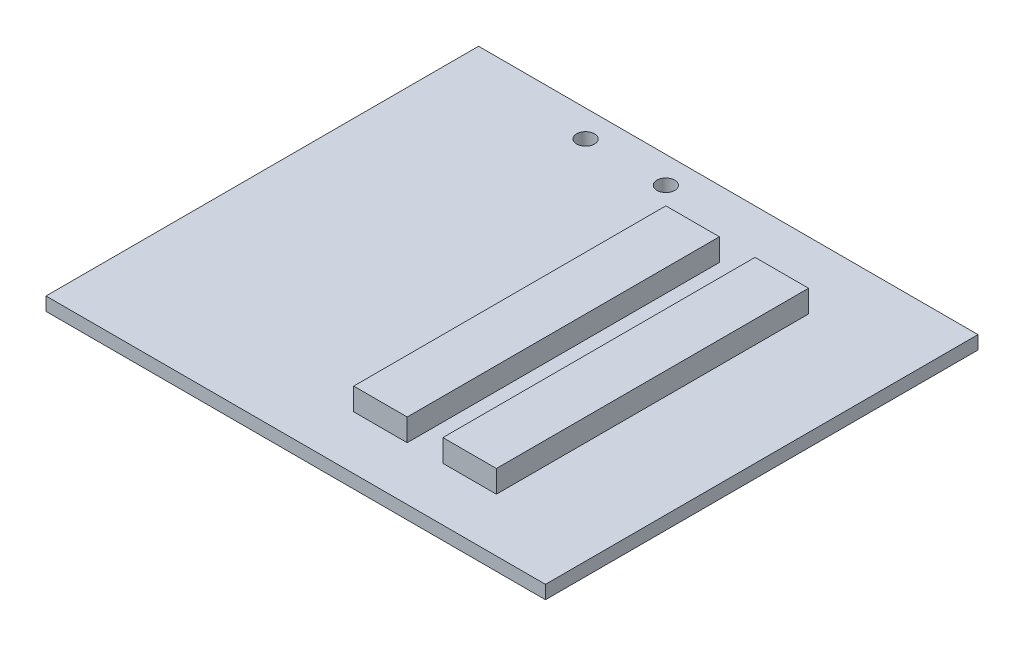
ISO-10303-21;
HEADER;
FILE_DESCRIPTION(('STEP AP214'),'2;1');
FILE_NAME('part.step','',(''),(''),'','','');
FILE_SCHEMA(('AUTOMOTIVE_DESIGN { 1 0 10303 214 1 1 1 1 }'));
ENDSEC;
DATA;
#1=APPLICATION_CONTEXT('core data for automotive mechanical design processes');
#2=APPLICATION_PROTOCOL_DEFINITION('international standard','automotive_design',2000,#1);
#3=PRODUCT_CONTEXT('',#1,'mechanical');
#4=PRODUCT('Part','Part','',(#3));
#5=PRODUCT_RELATED_PRODUCT_CATEGORY('part','',(#4));
#6=PRODUCT_DEFINITION_FORMATION('','',#4);
#7=PRODUCT_DEFINITION_CONTEXT('part definition',#1,'design');
#8=PRODUCT_DEFINITION('design','',#6,#7);
#9=PRODUCT_DEFINITION_SHAPE('','',#8);
#10=(LENGTH_UNIT() NAMED_UNIT(*) SI_UNIT(.MILLI.,.METRE.));
#11=(NAMED_UNIT(*) PLANE_ANGLE_UNIT() SI_UNIT($,.RADIAN.));
#12=(NAMED_UNIT(*) SI_UNIT($,.STERADIAN.) SOLID_ANGLE_UNIT());
#13=UNCERTAINTY_MEASURE_WITH_UNIT(LENGTH_MEASURE(1.E-05),#10,'distance_accuracy_value','');
#14=(GEOMETRIC_REPRESENTATION_CONTEXT(3) GLOBAL_UNCERTAINTY_ASSIGNED_CONTEXT((#13)) GLOBAL_UNIT_ASSIGNED_CONTEXT((#10,
#11,#12)) REPRESENTATION_CONTEXT('',''));
#15=CARTESIAN_POINT('',(0.,0.,0.));
#16=DIRECTION('',(0.,0.,1.));
#17=DIRECTION('',(1.,0.,0.));
#18=AXIS2_PLACEMENT_3D('',#15,#16,#17);
#19=CARTESIAN_POINT('',(0.,0.,0.));
#20=DIRECTION('',(0.,1.,0.));
#21=DIRECTION('',(0.,0.,1.));
#22=AXIS2_PLACEMENT_3D('',#19,#20,#21);
#23=PLANE('',#22);
#24=CARTESIAN_POINT('',(-4.00000000000001,0.,-21.25));
#25=DIRECTION('',(0.,1.,0.));
#26=DIRECTION('',(0.,0.,1.));
#27=AXIS2_PLACEMENT_3D('',#24,#25,#26);
#28=CIRCLE('',#27,1.);
#29=CARTESIAN_POINT('',(-4.00000000000001,0.,-20.25));
#30=VERTEX_POINT('',#29);
#31=EDGE_CURVE('E236',#30,#30,#28,.T.);
#32=ORIENTED_EDGE('',*,*,#31,.T.);
#33=EDGE_LOOP('',(#32));
#34=FACE_BOUND('',#33,.T.);
#35=CARTESIAN_POINT('',(-13.,0.,-21.25));
#36=DIRECTION('',(0.,1.,0.));
#37=DIRECTION('',(0.,0.,1.));
#38=AXIS2_PLACEMENT_3D('',#35,#36,#37);
#39=CIRCLE('',#38,1.);
#40=CARTESIAN_POINT('',(-13.,0.,-20.25));
#41=VERTEX_POINT('',#40);
#42=EDGE_CURVE('E240',#41,#41,#39,.T.);
#43=ORIENTED_EDGE('',*,*,#42,.T.);
#44=EDGE_LOOP('',(#43));
#45=FACE_BOUND('',#44,.T.);
#46=DIRECTION('',(1.,0.,0.));
#47=VECTOR('',#46,1.);
#48=CARTESIAN_POINT('',(-22.5,0.,-13.25));
#49=LINE('',#48,#47);
#50=CARTESIAN_POINT('',(-28.,0.,-13.25));
#51=VERTEX_POINT('',#50);
#52=CARTESIAN_POINT('',(-22.5,0.,-13.25));
#53=VERTEX_POINT('',#52);
#54=EDGE_CURVE('E11',#51,#53,#49,.T.);
#55=ORIENTED_EDGE('',*,*,#54,.F.);
#56=DIRECTION('',(0.,0.,1.));
#57=VECTOR('',#56,1.);
#58=CARTESIAN_POINT('',(-28.,0.,-24.25));
#59=LINE('',#58,#57);
#60=CARTESIAN_POINT('',(-28.,0.,-24.25));
#61=VERTEX_POINT('',#60);
#62=EDGE_CURVE('E265',#61,#51,#59,.T.);
#63=ORIENTED_EDGE('',*,*,#62,.F.);
#64=DIRECTION('',(-1.,0.,0.));
#65=VECTOR('',#64,1.);
#66=CARTESIAN_POINT('',(-28.,0.,-24.25));
#67=LINE('',#66,#65);
#68=CARTESIAN_POINT('',(28.,0.,-24.25));
#69=VERTEX_POINT('',#68);
#70=EDGE_CURVE('E262',#69,#61,#67,.T.);
#71=ORIENTED_EDGE('',*,*,#70,.F.);
#72=DIRECTION('',(0.,0.,-1.));
#73=VECTOR('',#72,1.);
#74=CARTESIAN_POINT('',(28.,0.,-24.25));
#75=LINE('',#74,#73);
#76=CARTESIAN_POINT('',(28.,0.,24.25));
#77=VERTEX_POINT('',#76);
#78=EDGE_CURVE('E246',#77,#69,#75,.T.);
#79=ORIENTED_EDGE('',*,*,#78,.F.);
#80=DIRECTION('',(1.,0.,0.));
#81=VECTOR('',#80,1.);
#82=CARTESIAN_POINT('',(-28.,0.,24.25));
#83=LINE('',#82,#81);
#84=CARTESIAN_POINT('',(-28.,0.,24.25));
#85=VERTEX_POINT('',#84);
#86=EDGE_CURVE('E253',#85,#77,#83,.T.);
#87=ORIENTED_EDGE('',*,*,#86,.F.);
#88=CARTESIAN_POINT('',(-28.,0.,-1.25));
#89=VERTEX_POINT('',#88);
#90=EDGE_CURVE('E264',#89,#85,#59,.T.);
#91=ORIENTED_EDGE('',*,*,#90,.F.);
#92=DIRECTION('',(-1.,0.,0.));
#93=VECTOR('',#92,1.);
#94=CARTESIAN_POINT('',(-22.5,0.,-1.25));
#95=LINE('',#94,#93);
#96=CARTESIAN_POINT('',(-22.5,0.,-1.25));
#97=VERTEX_POINT('',#96);
#98=EDGE_CURVE('E54',#97,#89,#95,.T.);
#99=ORIENTED_EDGE('',*,*,#98,.F.);
#100=DIRECTION('',(0.,0.,1.));
#101=VECTOR('',#100,1.);
#102=CARTESIAN_POINT('',(-22.5,0.,-1.25));
#103=LINE('',#102,#101);
#104=EDGE_CURVE('E50',#53,#97,#103,.T.);
#105=ORIENTED_EDGE('',*,*,#104,.F.);
#106=EDGE_LOOP('',(#55,#63,#71,#79,#87,#91,#99,#105));
#107=FACE_BOUND('',#106,.T.);
#108=ADVANCED_FACE('F33',(#34,#45,#107),#23,.F.);
#109=CARTESIAN_POINT('',(0.,1.5,0.));
#110=DIRECTION('',(0.,1.,0.));
#111=DIRECTION('',(0.,0.,1.));
#112=AXIS2_PLACEMENT_3D('',#109,#110,#111);
#113=PLANE('',#112);
#114=CARTESIAN_POINT('',(-13.,1.5,-21.25));
#115=DIRECTION('',(0.,1.,0.));
#116=DIRECTION('',(0.,0.,1.));
#117=AXIS2_PLACEMENT_3D('',#114,#115,#116);
#118=CIRCLE('',#117,1.);
#119=CARTESIAN_POINT('',(-13.,1.5,-20.25));
#120=VERTEX_POINT('',#119);
#121=EDGE_CURVE('E243',#120,#120,#118,.T.);
#122=ORIENTED_EDGE('',*,*,#121,.F.);
#123=EDGE_LOOP('',(#122));
#124=FACE_BOUND('',#123,.T.);
#125=DIRECTION('',(0.,0.,-1.));
#126=VECTOR('',#125,1.);
#127=CARTESIAN_POINT('',(28.,1.5,-24.25));
#128=LINE('',#127,#126);
#129=CARTESIAN_POINT('',(28.,1.5,24.25));
#130=VERTEX_POINT('',#129);
#131=CARTESIAN_POINT('',(28.,1.5,-24.25));
#132=VERTEX_POINT('',#131);
#133=EDGE_CURVE('E249',#130,#132,#128,.T.);
#134=ORIENTED_EDGE('',*,*,#133,.T.);
#135=DIRECTION('',(-1.,0.,0.));
#136=VECTOR('',#135,1.);
#137=CARTESIAN_POINT('',(-28.,1.5,-24.25));
#138=LINE('',#137,#136);
#139=CARTESIAN_POINT('',(-28.,1.5,-24.25));
#140=VERTEX_POINT('',#139);
#141=EDGE_CURVE('E252',#132,#140,#138,.T.);
#142=ORIENTED_EDGE('',*,*,#141,.T.);
#143=DIRECTION('',(0.,0.,1.));
#144=VECTOR('',#143,1.);
#145=CARTESIAN_POINT('',(-28.,1.5,-24.25));
#146=LINE('',#145,#144);
#147=CARTESIAN_POINT('',(-28.,1.5,24.25));
#148=VERTEX_POINT('',#147);
#149=EDGE_CURVE('E255',#140,#148,#146,.T.);
#150=ORIENTED_EDGE('',*,*,#149,.T.);
#151=DIRECTION('',(1.,0.,0.));
#152=VECTOR('',#151,1.);
#153=CARTESIAN_POINT('',(-28.,1.5,24.25));
#154=LINE('',#153,#152);
#155=EDGE_CURVE('E257',#148,#130,#154,.T.);
#156=ORIENTED_EDGE('',*,*,#155,.T.);
#157=EDGE_LOOP('',(#134,#142,#150,#156));
#158=FACE_BOUND('',#157,.T.);
#159=CARTESIAN_POINT('',(-4.00000000000001,1.5,-21.25));
#160=DIRECTION('',(0.,1.,0.));
#161=DIRECTION('',(0.,0.,1.));
#162=AXIS2_PLACEMENT_3D('',#159,#160,#161);
#163=CIRCLE('',#162,1.);
#164=CARTESIAN_POINT('',(-4.00000000000001,1.5,-20.25));
#165=VERTEX_POINT('',#164);
#166=EDGE_CURVE('E237',#165,#165,#163,.T.);
#167=ORIENTED_EDGE('',*,*,#166,.F.);
#168=EDGE_LOOP('',(#167));
#169=FACE_BOUND('',#168,.T.);
#170=DIRECTION('',(1.,0.,0.));
#171=VECTOR('',#170,1.);
#172=CARTESIAN_POINT('',(0.500000000000005,1.5,18.25));
#173=LINE('',#172,#171);
#174=CARTESIAN_POINT('',(0.500000000000005,1.5,18.25));
#175=VERTEX_POINT('',#174);
#176=CARTESIAN_POINT('',(6.50000000000001,1.5,18.25));
#177=VERTEX_POINT('',#176);
#178=EDGE_CURVE('E221',#175,#177,#173,.T.);
#179=ORIENTED_EDGE('',*,*,#178,.F.);
#180=DIRECTION('',(0.,0.,1.));
#181=VECTOR('',#180,1.);
#182=CARTESIAN_POINT('',(0.5,1.5,-16.75));
#183=LINE('',#182,#181);
#184=CARTESIAN_POINT('',(0.5,1.5,-16.75));
#185=VERTEX_POINT('',#184);
#186=EDGE_CURVE('E207',#185,#175,#183,.T.);
#187=ORIENTED_EDGE('',*,*,#186,.F.);
#188=DIRECTION('',(-1.,0.,0.));
#189=VECTOR('',#188,1.);
#190=CARTESIAN_POINT('',(0.5,1.5,-16.75));
#191=LINE('',#190,#189);
#192=CARTESIAN_POINT('',(6.5,1.5,-16.75));
#193=VERTEX_POINT('',#192);
#194=EDGE_CURVE('E212',#193,#185,#191,.T.);
#195=ORIENTED_EDGE('',*,*,#194,.F.);
#196=DIRECTION('',(0.,0.,-1.));
#197=VECTOR('',#196,1.);
#198=CARTESIAN_POINT('',(6.5,1.5,-16.75));
#199=LINE('',#198,#197);
#200=EDGE_CURVE('E223',#177,#193,#199,.T.);
#201=ORIENTED_EDGE('',*,*,#200,.F.);
#202=EDGE_LOOP('',(#179,#187,#195,#201));
#203=FACE_BOUND('',#202,.T.);
#204=DIRECTION('',(1.,0.,0.));
#205=VECTOR('',#204,1.);
#206=CARTESIAN_POINT('',(10.5,1.5,18.25));
#207=LINE('',#206,#205);
#208=CARTESIAN_POINT('',(10.5,1.5,18.25));
#209=VERTEX_POINT('',#208);
#210=CARTESIAN_POINT('',(16.5,1.5,18.25));
#211=VERTEX_POINT('',#210);
#212=EDGE_CURVE('E176',#209,#211,#207,.T.);
#213=ORIENTED_EDGE('',*,*,#212,.F.);
#214=DIRECTION('',(0.,0.,1.));
#215=VECTOR('',#214,1.);
#216=CARTESIAN_POINT('',(10.5,1.5,-16.75));
#217=LINE('',#216,#215);
#218=CARTESIAN_POINT('',(10.5,1.5,-16.75));
#219=VERTEX_POINT('',#218);
#220=EDGE_CURVE('E173',#219,#209,#217,.T.);
#221=ORIENTED_EDGE('',*,*,#220,.F.);
#222=DIRECTION('',(-1.,0.,0.));
#223=VECTOR('',#222,1.);
#224=CARTESIAN_POINT('',(10.5,1.5,-16.75));
#225=LINE('',#224,#223);
#226=CARTESIAN_POINT('',(16.5,1.5,-16.75));
#227=VERTEX_POINT('',#226);
#228=EDGE_CURVE('E186',#227,#219,#225,.T.);
#229=ORIENTED_EDGE('',*,*,#228,.F.);
#230=DIRECTION('',(0.,0.,-1.));
#231=VECTOR('',#230,1.);
#232=CARTESIAN_POINT('',(16.5,1.5,-16.75));
#233=LINE('',#232,#231);
#234=EDGE_CURVE('E194',#211,#227,#233,.T.);
#235=ORIENTED_EDGE('',*,*,#234,.F.);
#236=EDGE_LOOP('',(#213,#221,#229,#235));
#237=FACE_BOUND('',#236,.T.);
#238=ADVANCED_FACE('F321',(#124,#158,#169,#203,#237),#113,.T.);
#239=CARTESIAN_POINT('',(28.,1.5,-24.25));
#240=DIRECTION('',(-1.,0.,0.));
#241=DIRECTION('',(0.,0.,1.));
#242=AXIS2_PLACEMENT_3D('',#239,#240,#241);
#243=PLANE('',#242);
#244=ORIENTED_EDGE('',*,*,#78,.T.);
#245=DIRECTION('',(0.,-1.,0.));
#246=VECTOR('',#245,1.);
#247=CARTESIAN_POINT('',(28.,1.5,-24.25));
#248=LINE('',#247,#246);
#249=EDGE_CURVE('E37',#132,#69,#248,.T.);
#250=ORIENTED_EDGE('',*,*,#249,.F.);
#251=ORIENTED_EDGE('',*,*,#133,.F.);
#252=DIRECTION('',(0.,-1.,0.));
#253=VECTOR('',#252,1.);
#254=CARTESIAN_POINT('',(28.,1.5,24.25));
#255=LINE('',#254,#253);
#256=EDGE_CURVE('E259',#130,#77,#255,.T.);
#257=ORIENTED_EDGE('',*,*,#256,.T.);
#258=EDGE_LOOP('',(#244,#250,#251,#257));
#259=FACE_BOUND('',#258,.T.);
#260=ADVANCED_FACE('F35',(#259),#243,.F.);
#261=CARTESIAN_POINT('',(-28.,1.5,-24.25));
#262=DIRECTION('',(0.,0.,1.));
#263=DIRECTION('',(1.,0.,0.));
#264=AXIS2_PLACEMENT_3D('',#261,#262,#263);
#265=PLANE('',#264);
#266=ORIENTED_EDGE('',*,*,#70,.T.);
#267=DIRECTION('',(0.,-1.,0.));
#268=VECTOR('',#267,1.);
#269=CARTESIAN_POINT('',(-28.,1.5,-24.25));
#270=LINE('',#269,#268);
#271=EDGE_CURVE('E274',#140,#61,#270,.T.);
#272=ORIENTED_EDGE('',*,*,#271,.F.);
#273=ORIENTED_EDGE('',*,*,#141,.F.);
#274=ORIENTED_EDGE('',*,*,#249,.T.);
#275=EDGE_LOOP('',(#266,#272,#273,#274));
#276=FACE_BOUND('',#275,.T.);
#277=ADVANCED_FACE('F283',(#276),#265,.F.);
#278=CARTESIAN_POINT('',(-28.,1.5,-24.25));
#279=DIRECTION('',(1.,0.,0.));
#280=DIRECTION('',(0.,0.,-1.));
#281=AXIS2_PLACEMENT_3D('',#278,#279,#280);
#282=PLANE('',#281);
#283=ORIENTED_EDGE('',*,*,#62,.T.);
#284=EDGE_CURVE('E268',#51,#89,#59,.T.);
#285=ORIENTED_EDGE('',*,*,#284,.T.);
#286=ORIENTED_EDGE('',*,*,#90,.T.);
#287=DIRECTION('',(0.,-1.,0.));
#288=VECTOR('',#287,1.);
#289=CARTESIAN_POINT('',(-28.,1.5,24.25));
#290=LINE('',#289,#288);
#291=EDGE_CURVE('E272',#148,#85,#290,.T.);
#292=ORIENTED_EDGE('',*,*,#291,.F.);
#293=ORIENTED_EDGE('',*,*,#149,.F.);
#294=ORIENTED_EDGE('',*,*,#271,.T.);
#295=EDGE_LOOP('',(#283,#285,#286,#292,#293,#294));
#296=FACE_BOUND('',#295,.T.);
#297=ADVANCED_FACE('F290',(#296),#282,.F.);
#298=CARTESIAN_POINT('',(-28.,1.5,24.25));
#299=DIRECTION('',(0.,0.,-1.));
#300=DIRECTION('',(-1.,0.,0.));
#301=AXIS2_PLACEMENT_3D('',#298,#299,#300);
#302=PLANE('',#301);
#303=ORIENTED_EDGE('',*,*,#86,.T.);
#304=ORIENTED_EDGE('',*,*,#256,.F.);
#305=ORIENTED_EDGE('',*,*,#155,.F.);
#306=ORIENTED_EDGE('',*,*,#291,.T.);
#307=EDGE_LOOP('',(#303,#304,#305,#306));
#308=FACE_BOUND('',#307,.T.);
#309=ADVANCED_FACE('F332',(#308),#302,.F.);
#310=CARTESIAN_POINT('',(-13.,1.5,-21.25));
#311=DIRECTION('',(0.,-1.,0.));
#312=DIRECTION('',(0.,0.,-1.));
#313=AXIS2_PLACEMENT_3D('',#310,#311,#312);
#314=CYLINDRICAL_SURFACE('',#313,1.);
#315=ORIENTED_EDGE('',*,*,#121,.T.);
#316=EDGE_LOOP('',(#315));
#317=FACE_BOUND('',#316,.T.);
#318=ORIENTED_EDGE('',*,*,#42,.F.);
#319=EDGE_LOOP('',(#318));
#320=FACE_BOUND('',#319,.T.);
#321=ADVANCED_FACE('F335',(#317,#320),#314,.F.);
#322=CARTESIAN_POINT('',(-4.00000000000001,1.5,-21.25));
#323=DIRECTION('',(0.,-1.,0.));
#324=DIRECTION('',(0.,0.,-1.));
#325=AXIS2_PLACEMENT_3D('',#322,#323,#324);
#326=CYLINDRICAL_SURFACE('',#325,1.);
#327=ORIENTED_EDGE('',*,*,#166,.T.);
#328=EDGE_LOOP('',(#327));
#329=FACE_BOUND('',#328,.T.);
#330=ORIENTED_EDGE('',*,*,#31,.F.);
#331=EDGE_LOOP('',(#330));
#332=FACE_BOUND('',#331,.T.);
#333=ADVANCED_FACE('F356',(#329,#332),#326,.F.);
#334=CARTESIAN_POINT('',(0.5,4.,-16.75));
#335=DIRECTION('',(1.,0.,0.));
#336=DIRECTION('',(0.,0.,-1.));
#337=AXIS2_PLACEMENT_3D('',#334,#335,#336);
#338=PLANE('',#337);
#339=ORIENTED_EDGE('',*,*,#186,.T.);
#340=DIRECTION('',(0.,-1.,0.));
#341=VECTOR('',#340,1.);
#342=CARTESIAN_POINT('',(0.500000000000005,4.,18.25));
#343=LINE('',#342,#341);
#344=CARTESIAN_POINT('',(0.500000000000005,4.,18.25));
#345=VERTEX_POINT('',#344);
#346=EDGE_CURVE('E234',#345,#175,#343,.T.);
#347=ORIENTED_EDGE('',*,*,#346,.F.);
#348=DIRECTION('',(0.,0.,1.));
#349=VECTOR('',#348,1.);
#350=CARTESIAN_POINT('',(0.5,4.,-16.75));
#351=LINE('',#350,#349);
#352=CARTESIAN_POINT('',(0.5,4.,-16.75));
#353=VERTEX_POINT('',#352);
#354=EDGE_CURVE('E208',#353,#345,#351,.T.);
#355=ORIENTED_EDGE('',*,*,#354,.F.);
#356=DIRECTION('',(0.,-1.,0.));
#357=VECTOR('',#356,1.);
#358=CARTESIAN_POINT('',(0.5,4.,-16.75));
#359=LINE('',#358,#357);
#360=EDGE_CURVE('E218',#353,#185,#359,.T.);
#361=ORIENTED_EDGE('',*,*,#360,.T.);
#362=EDGE_LOOP('',(#339,#347,#355,#361));
#363=FACE_BOUND('',#362,.T.);
#364=ADVANCED_FACE('F360',(#363),#338,.F.);
#365=CARTESIAN_POINT('',(0.500000000000005,4.,18.25));
#366=DIRECTION('',(0.,0.,-1.));
#367=DIRECTION('',(-1.,0.,0.));
#368=AXIS2_PLACEMENT_3D('',#365,#366,#367);
#369=PLANE('',#368);
#370=ORIENTED_EDGE('',*,*,#178,.T.);
#371=DIRECTION('',(0.,-1.,0.));
#372=VECTOR('',#371,1.);
#373=CARTESIAN_POINT('',(6.50000000000001,4.,18.25));
#374=LINE('',#373,#372);
#375=CARTESIAN_POINT('',(6.50000000000001,4.,18.25));
#376=VERTEX_POINT('',#375);
#377=EDGE_CURVE('E231',#376,#177,#374,.T.);
#378=ORIENTED_EDGE('',*,*,#377,.F.);
#379=DIRECTION('',(1.,0.,0.));
#380=VECTOR('',#379,1.);
#381=CARTESIAN_POINT('',(0.500000000000005,4.,18.25));
#382=LINE('',#381,#380);
#383=EDGE_CURVE('E211',#345,#376,#382,.T.);
#384=ORIENTED_EDGE('',*,*,#383,.F.);
#385=ORIENTED_EDGE('',*,*,#346,.T.);
#386=EDGE_LOOP('',(#370,#378,#384,#385));
#387=FACE_BOUND('',#386,.T.);
#388=ADVANCED_FACE('F364',(#387),#369,.F.);
#389=CARTESIAN_POINT('',(6.5,4.,-16.75));
#390=DIRECTION('',(-1.,0.,0.));
#391=DIRECTION('',(0.,0.,1.));
#392=AXIS2_PLACEMENT_3D('',#389,#390,#391);
#393=PLANE('',#392);
#394=ORIENTED_EDGE('',*,*,#200,.T.);
#395=DIRECTION('',(0.,-1.,0.));
#396=VECTOR('',#395,1.);
#397=CARTESIAN_POINT('',(6.5,4.,-16.75));
#398=LINE('',#397,#396);
#399=CARTESIAN_POINT('',(6.5,4.,-16.75));
#400=VERTEX_POINT('',#399);
#401=EDGE_CURVE('E229',#400,#193,#398,.T.);
#402=ORIENTED_EDGE('',*,*,#401,.F.);
#403=DIRECTION('',(0.,0.,-1.));
#404=VECTOR('',#403,1.);
#405=CARTESIAN_POINT('',(6.5,4.,-16.75));
#406=LINE('',#405,#404);
#407=EDGE_CURVE('E214',#376,#400,#406,.T.);
#408=ORIENTED_EDGE('',*,*,#407,.F.);
#409=ORIENTED_EDGE('',*,*,#377,.T.);
#410=EDGE_LOOP('',(#394,#402,#408,#409));
#411=FACE_BOUND('',#410,.T.);
#412=ADVANCED_FACE('F374',(#411),#393,.F.);
#413=CARTESIAN_POINT('',(0.5,4.,-16.75));
#414=DIRECTION('',(0.,0.,1.));
#415=DIRECTION('',(1.,0.,0.));
#416=AXIS2_PLACEMENT_3D('',#413,#414,#415);
#417=PLANE('',#416);
#418=ORIENTED_EDGE('',*,*,#194,.T.);
#419=ORIENTED_EDGE('',*,*,#360,.F.);
#420=DIRECTION('',(-1.,0.,0.));
#421=VECTOR('',#420,1.);
#422=CARTESIAN_POINT('',(0.5,4.,-16.75));
#423=LINE('',#422,#421);
#424=EDGE_CURVE('E216',#400,#353,#423,.T.);
#425=ORIENTED_EDGE('',*,*,#424,.F.);
#426=ORIENTED_EDGE('',*,*,#401,.T.);
#427=EDGE_LOOP('',(#418,#419,#425,#426));
#428=FACE_BOUND('',#427,.T.);
#429=ADVANCED_FACE('F384',(#428),#417,.F.);
#430=CARTESIAN_POINT('',(0.,4.,0.));
#431=DIRECTION('',(0.,1.,0.));
#432=DIRECTION('',(0.,0.,1.));
#433=AXIS2_PLACEMENT_3D('',#430,#431,#432);
#434=PLANE('',#433);
#435=ORIENTED_EDGE('',*,*,#354,.T.);
#436=ORIENTED_EDGE('',*,*,#383,.T.);
#437=ORIENTED_EDGE('',*,*,#407,.T.);
#438=ORIENTED_EDGE('',*,*,#424,.T.);
#439=EDGE_LOOP('',(#435,#436,#437,#438));
#440=FACE_BOUND('',#439,.T.);
#441=ADVANCED_FACE('F394',(#440),#434,.T.);
#442=CARTESIAN_POINT('',(10.5,4.,-16.75));
#443=DIRECTION('',(1.,0.,0.));
#444=DIRECTION('',(0.,0.,-1.));
#445=AXIS2_PLACEMENT_3D('',#442,#443,#444);
#446=PLANE('',#445);
#447=ORIENTED_EDGE('',*,*,#220,.T.);
#448=DIRECTION('',(0.,-1.,0.));
#449=VECTOR('',#448,1.);
#450=CARTESIAN_POINT('',(10.5,4.,18.25));
#451=LINE('',#450,#449);
#452=CARTESIAN_POINT('',(10.5,4.,18.25));
#453=VERTEX_POINT('',#452);
#454=EDGE_CURVE('E205',#453,#209,#451,.T.);
#455=ORIENTED_EDGE('',*,*,#454,.F.);
#456=DIRECTION('',(0.,0.,1.));
#457=VECTOR('',#456,1.);
#458=CARTESIAN_POINT('',(10.5,4.,-16.75));
#459=LINE('',#458,#457);
#460=CARTESIAN_POINT('',(10.5,4.,-16.75));
#461=VERTEX_POINT('',#460);
#462=EDGE_CURVE('E182',#461,#453,#459,.T.);
#463=ORIENTED_EDGE('',*,*,#462,.F.);
#464=DIRECTION('',(0.,-1.,0.));
#465=VECTOR('',#464,1.);
#466=CARTESIAN_POINT('',(10.5,4.,-16.75));
#467=LINE('',#466,#465);
#468=EDGE_CURVE('E191',#461,#219,#467,.T.);
#469=ORIENTED_EDGE('',*,*,#468,.T.);
#470=EDGE_LOOP('',(#447,#455,#463,#469));
#471=FACE_BOUND('',#470,.T.);
#472=ADVANCED_FACE('F404',(#471),#446,.F.);
#473=CARTESIAN_POINT('',(10.5,4.,18.25));
#474=DIRECTION('',(0.,0.,-1.));
#475=DIRECTION('',(-1.,0.,0.));
#476=AXIS2_PLACEMENT_3D('',#473,#474,#475);
#477=PLANE('',#476);
#478=ORIENTED_EDGE('',*,*,#212,.T.);
#479=DIRECTION('',(0.,-1.,0.));
#480=VECTOR('',#479,1.);
#481=CARTESIAN_POINT('',(16.5,4.,18.25));
#482=LINE('',#481,#480);
#483=CARTESIAN_POINT('',(16.5,4.,18.25));
#484=VERTEX_POINT('',#483);
#485=EDGE_CURVE('E202',#484,#211,#482,.T.);
#486=ORIENTED_EDGE('',*,*,#485,.F.);
#487=DIRECTION('',(1.,0.,0.));
#488=VECTOR('',#487,1.);
#489=CARTESIAN_POINT('',(10.5,4.,18.25));
#490=LINE('',#489,#488);
#491=EDGE_CURVE('E185',#453,#484,#490,.T.);
#492=ORIENTED_EDGE('',*,*,#491,.F.);
#493=ORIENTED_EDGE('',*,*,#454,.T.);
#494=EDGE_LOOP('',(#478,#486,#492,#493));
#495=FACE_BOUND('',#494,.T.);
#496=ADVANCED_FACE('F414',(#495),#477,.F.);
#497=CARTESIAN_POINT('',(16.5,4.,-16.75));
#498=DIRECTION('',(-1.,0.,0.));
#499=DIRECTION('',(0.,0.,1.));
#500=AXIS2_PLACEMENT_3D('',#497,#498,#499);
#501=PLANE('',#500);
#502=ORIENTED_EDGE('',*,*,#234,.T.);
#503=DIRECTION('',(0.,-1.,0.));
#504=VECTOR('',#503,1.);
#505=CARTESIAN_POINT('',(16.5,4.,-16.75));
#506=LINE('',#505,#504);
#507=CARTESIAN_POINT('',(16.5,4.,-16.75));
#508=VERTEX_POINT('',#507);
#509=EDGE_CURVE('E200',#508,#227,#506,.T.);
#510=ORIENTED_EDGE('',*,*,#509,.F.);
#511=DIRECTION('',(0.,0.,-1.));
#512=VECTOR('',#511,1.);
#513=CARTESIAN_POINT('',(16.5,4.,-16.75));
#514=LINE('',#513,#512);
#515=EDGE_CURVE('E188',#484,#508,#514,.T.);
#516=ORIENTED_EDGE('',*,*,#515,.F.);
#517=ORIENTED_EDGE('',*,*,#485,.T.);
#518=EDGE_LOOP('',(#502,#510,#516,#517));
#519=FACE_BOUND('',#518,.T.);
#520=ADVANCED_FACE('F424',(#519),#501,.F.);
#521=CARTESIAN_POINT('',(10.5,4.,-16.75));
#522=DIRECTION('',(0.,0.,1.));
#523=DIRECTION('',(1.,0.,0.));
#524=AXIS2_PLACEMENT_3D('',#521,#522,#523);
#525=PLANE('',#524);
#526=ORIENTED_EDGE('',*,*,#228,.T.);
#527=ORIENTED_EDGE('',*,*,#468,.F.);
#528=DIRECTION('',(-1.,0.,0.));
#529=VECTOR('',#528,1.);
#530=CARTESIAN_POINT('',(10.5,4.,-16.75));
#531=LINE('',#530,#529);
#532=EDGE_CURVE('E190',#508,#461,#531,.T.);
#533=ORIENTED_EDGE('',*,*,#532,.F.);
#534=ORIENTED_EDGE('',*,*,#509,.T.);
#535=EDGE_LOOP('',(#526,#527,#533,#534));
#536=FACE_BOUND('',#535,.T.);
#537=ADVANCED_FACE('F434',(#536),#525,.F.);
#538=CARTESIAN_POINT('',(0.,4.,0.));
#539=DIRECTION('',(0.,1.,0.));
#540=DIRECTION('',(0.,0.,1.));
#541=AXIS2_PLACEMENT_3D('',#538,#539,#540);
#542=PLANE('',#541);
#543=ORIENTED_EDGE('',*,*,#462,.T.);
#544=ORIENTED_EDGE('',*,*,#491,.T.);
#545=ORIENTED_EDGE('',*,*,#515,.T.);
#546=ORIENTED_EDGE('',*,*,#532,.T.);
#547=EDGE_LOOP('',(#543,#544,#545,#546));
#548=FACE_BOUND('',#547,.T.);
#549=ADVANCED_FACE('F444',(#548),#542,.T.);
#550=CARTESIAN_POINT('',(0.,0.,0.));
#551=DIRECTION('',(0.,1.,0.));
#552=DIRECTION('',(0.,0.,1.));
#553=AXIS2_PLACEMENT_3D('',#550,#551,#552);
#554=PLANE('',#553);
#555=ORIENTED_EDGE('',*,*,#284,.F.);
#556=CARTESIAN_POINT('',(-28.5,0.,-13.25));
#557=VERTEX_POINT('',#556);
#558=EDGE_CURVE('E43',#557,#51,#49,.T.);
#559=ORIENTED_EDGE('',*,*,#558,.F.);
#560=DIRECTION('',(0.,0.,-1.));
#561=VECTOR('',#560,1.);
#562=CARTESIAN_POINT('',(-28.5,0.,-1.25));
#563=LINE('',#562,#561);
#564=CARTESIAN_POINT('',(-28.5,0.,-1.25));
#565=VERTEX_POINT('',#564);
#566=EDGE_CURVE('E302',#565,#557,#563,.T.);
#567=ORIENTED_EDGE('',*,*,#566,.F.);
#568=EDGE_CURVE('E297',#89,#565,#95,.T.);
#569=ORIENTED_EDGE('',*,*,#568,.F.);
#570=EDGE_LOOP('',(#555,#559,#567,#569));
#571=FACE_BOUND('',#570,.T.);
#572=ADVANCED_FACE('F295',(#571),#554,.T.);
#573=CARTESIAN_POINT('',(-22.5,-4.5,-1.25));
#574=DIRECTION('',(-1.,0.,0.));
#575=DIRECTION('',(0.,0.,1.));
#576=AXIS2_PLACEMENT_3D('',#573,#574,#575);
#577=PLANE('',#576);
#578=ORIENTED_EDGE('',*,*,#104,.T.);
#579=DIRECTION('',(0.,1.,0.));
#580=VECTOR('',#579,1.);
#581=CARTESIAN_POINT('',(-22.5,-4.5,-1.25));
#582=LINE('',#581,#580);
#583=CARTESIAN_POINT('',(-22.5,-4.5,-1.25));
#584=VERTEX_POINT('',#583);
#585=EDGE_CURVE('E156',#584,#97,#582,.T.);
#586=ORIENTED_EDGE('',*,*,#585,.F.);
#587=DIRECTION('',(0.,0.,1.));
#588=VECTOR('',#587,1.);
#589=CARTESIAN_POINT('',(-22.5,-4.5,-1.25));
#590=LINE('',#589,#588);
#591=CARTESIAN_POINT('',(-22.5,-4.5,-13.25));
#592=VERTEX_POINT('',#591);
#593=EDGE_CURVE('E162',#592,#584,#590,.T.);
#594=ORIENTED_EDGE('',*,*,#593,.F.);
#595=DIRECTION('',(0.,1.,0.));
#596=VECTOR('',#595,1.);
#597=CARTESIAN_POINT('',(-22.5,-4.5,-13.25));
#598=LINE('',#597,#596);
#599=EDGE_CURVE('E306',#592,#53,#598,.T.);
#600=ORIENTED_EDGE('',*,*,#599,.T.);
#601=EDGE_LOOP('',(#578,#586,#594,#600));
#602=FACE_BOUND('',#601,.T.);
#603=ADVANCED_FACE('F172',(#602),#577,.F.);
#604=CARTESIAN_POINT('',(-22.5,-4.5,-1.25));
#605=DIRECTION('',(0.,0.,-1.));
#606=DIRECTION('',(-1.,0.,0.));
#607=AXIS2_PLACEMENT_3D('',#604,#605,#606);
#608=PLANE('',#607);
#609=ORIENTED_EDGE('',*,*,#98,.T.);
#610=ORIENTED_EDGE('',*,*,#568,.T.);
#611=DIRECTION('',(0.,1.,0.));
#612=VECTOR('',#611,1.);
#613=CARTESIAN_POINT('',(-28.5,-4.5,-1.25));
#614=LINE('',#613,#612);
#615=CARTESIAN_POINT('',(-28.5,-4.5,-1.25));
#616=VERTEX_POINT('',#615);
#617=EDGE_CURVE('E158',#616,#565,#614,.T.);
#618=ORIENTED_EDGE('',*,*,#617,.F.);
#619=DIRECTION('',(-1.,0.,0.));
#620=VECTOR('',#619,1.);
#621=CARTESIAN_POINT('',(-22.5,-4.5,-1.25));
#622=LINE('',#621,#620);
#623=EDGE_CURVE('E152',#584,#616,#622,.T.);
#624=ORIENTED_EDGE('',*,*,#623,.F.);
#625=ORIENTED_EDGE('',*,*,#585,.T.);
#626=EDGE_LOOP('',(#609,#610,#618,#624,#625));
#627=FACE_BOUND('',#626,.T.);
#628=ADVANCED_FACE('F154',(#627),#608,.F.);
#629=CARTESIAN_POINT('',(-28.5,-4.5,-1.25));
#630=DIRECTION('',(1.,0.,0.));
#631=DIRECTION('',(0.,0.,-1.));
#632=AXIS2_PLACEMENT_3D('',#629,#630,#631);
#633=PLANE('',#632);
#634=ORIENTED_EDGE('',*,*,#566,.T.);
#635=DIRECTION('',(0.,1.,0.));
#636=VECTOR('',#635,1.);
#637=CARTESIAN_POINT('',(-28.5,-4.5,-13.25));
#638=LINE('',#637,#636);
#639=CARTESIAN_POINT('',(-28.5,-4.5,-13.25));
#640=VERTEX_POINT('',#639);
#641=EDGE_CURVE('E178',#640,#557,#638,.T.);
#642=ORIENTED_EDGE('',*,*,#641,.F.);
#643=DIRECTION('',(0.,0.,-1.));
#644=VECTOR('',#643,1.);
#645=CARTESIAN_POINT('',(-28.5,-4.5,-1.25));
#646=LINE('',#645,#644);
#647=EDGE_CURVE('E161',#616,#640,#646,.T.);
#648=ORIENTED_EDGE('',*,*,#647,.F.);
#649=ORIENTED_EDGE('',*,*,#617,.T.);
#650=EDGE_LOOP('',(#634,#642,#648,#649));
#651=FACE_BOUND('',#650,.T.);
#652=ADVANCED_FACE('F311',(#651),#633,.F.);
#653=CARTESIAN_POINT('',(-22.5,-4.5,-13.25));
#654=DIRECTION('',(0.,0.,1.));
#655=DIRECTION('',(1.,0.,0.));
#656=AXIS2_PLACEMENT_3D('',#653,#654,#655);
#657=PLANE('',#656);
#658=ORIENTED_EDGE('',*,*,#558,.T.);
#659=ORIENTED_EDGE('',*,*,#54,.T.);
#660=ORIENTED_EDGE('',*,*,#599,.F.);
#661=DIRECTION('',(1.,0.,0.));
#662=VECTOR('',#661,1.);
#663=CARTESIAN_POINT('',(-22.5,-4.5,-13.25));
#664=LINE('',#663,#662);
#665=EDGE_CURVE('E167',#640,#592,#664,.T.);
#666=ORIENTED_EDGE('',*,*,#665,.F.);
#667=ORIENTED_EDGE('',*,*,#641,.T.);
#668=EDGE_LOOP('',(#658,#659,#660,#666,#667));
#669=FACE_BOUND('',#668,.T.);
#670=ADVANCED_FACE('F300',(#669),#657,.F.);
#671=CARTESIAN_POINT('',(0.,-4.5,0.));
#672=DIRECTION('',(0.,1.,0.));
#673=DIRECTION('',(0.,0.,1.));
#674=AXIS2_PLACEMENT_3D('',#671,#672,#673);
#675=PLANE('',#674);
#676=ORIENTED_EDGE('',*,*,#593,.T.);
#677=ORIENTED_EDGE('',*,*,#623,.T.);
#678=ORIENTED_EDGE('',*,*,#647,.T.);
#679=ORIENTED_EDGE('',*,*,#665,.T.);
#680=EDGE_LOOP('',(#676,#677,#678,#679));
#681=FACE_BOUND('',#680,.T.);
#682=ADVANCED_FACE('F165',(#681),#675,.F.);
#683=CLOSED_SHELL('',(#108,#238,#260,#277,#297,#309,#321,#333,#364,#388,#412,#429,#441,#472,
#496,#520,#537,#549,#572,#603,#628,#652,#670,#682));
#684=MANIFOLD_SOLID_BREP('B2',#683);
#685=ADVANCED_BREP_SHAPE_REPRESENTATION('',(#18,#684),#14);
#686=SHAPE_DEFINITION_REPRESENTATION(#9,#685);
ENDSEC;
END-ISO-10303-21;
